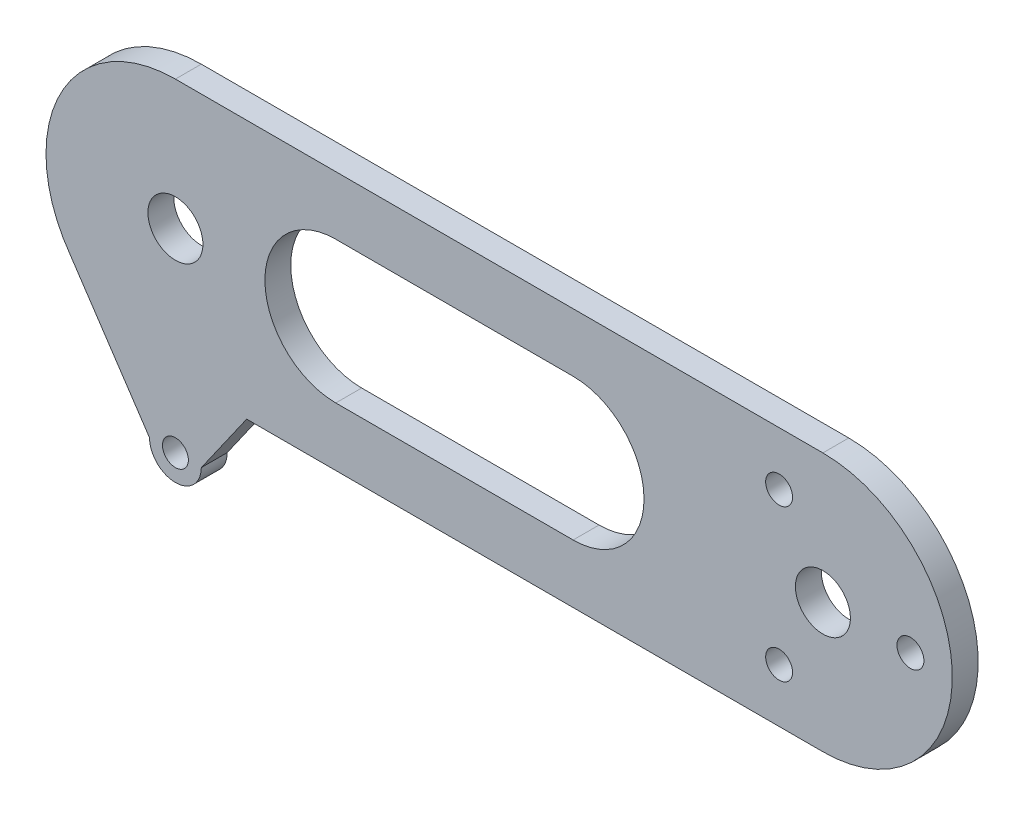
ISO-10303-21;
HEADER;
FILE_DESCRIPTION(('STEP AP214'),'2;1');
FILE_NAME('part.step','',(''),(''),'','','');
FILE_SCHEMA(('AUTOMOTIVE_DESIGN { 1 0 10303 214 1 1 1 1 }'));
ENDSEC;
DATA;
#1=APPLICATION_CONTEXT('core data for automotive mechanical design processes');
#2=APPLICATION_PROTOCOL_DEFINITION('international standard','automotive_design',2000,#1);
#3=PRODUCT_CONTEXT('',#1,'mechanical');
#4=PRODUCT('Part','Part','',(#3));
#5=PRODUCT_RELATED_PRODUCT_CATEGORY('part','',(#4));
#6=PRODUCT_DEFINITION_FORMATION('','',#4);
#7=PRODUCT_DEFINITION_CONTEXT('part definition',#1,'design');
#8=PRODUCT_DEFINITION('design','',#6,#7);
#9=PRODUCT_DEFINITION_SHAPE('','',#8);
#10=(LENGTH_UNIT() NAMED_UNIT(*) SI_UNIT(.MILLI.,.METRE.));
#11=(NAMED_UNIT(*) PLANE_ANGLE_UNIT() SI_UNIT($,.RADIAN.));
#12=(NAMED_UNIT(*) SI_UNIT($,.STERADIAN.) SOLID_ANGLE_UNIT());
#13=UNCERTAINTY_MEASURE_WITH_UNIT(LENGTH_MEASURE(1.E-05),#10,'distance_accuracy_value','');
#14=(GEOMETRIC_REPRESENTATION_CONTEXT(3) GLOBAL_UNCERTAINTY_ASSIGNED_CONTEXT((#13)) GLOBAL_UNIT_ASSIGNED_CONTEXT((#10,
#11,#12)) REPRESENTATION_CONTEXT('',''));
#15=CARTESIAN_POINT('',(0.,0.,0.));
#16=DIRECTION('',(0.,0.,1.));
#17=DIRECTION('',(1.,0.,0.));
#18=AXIS2_PLACEMENT_3D('',#15,#16,#17);
#19=CARTESIAN_POINT('',(-1.00000000000001,0.,4.));
#20=DIRECTION('',(0.,0.,-1.));
#21=DIRECTION('',(-1.,0.,0.));
#22=AXIS2_PLACEMENT_3D('',#19,#20,#21);
#23=PLANE('',#22);
#24=CARTESIAN_POINT('',(92.2992950056397,-11.7173237132034,4.));
#25=DIRECTION('',(0.,0.,1.));
#26=DIRECTION('',(1.,0.,0.));
#27=AXIS2_PLACEMENT_3D('',#24,#25,#26);
#28=CIRCLE('',#27,2.08);
#29=CARTESIAN_POINT('',(94.3792950056397,-11.7173237132034,4.));
#30=VERTEX_POINT('',#29);
#31=EDGE_CURVE('E155',#30,#30,#28,.T.);
#32=ORIENTED_EDGE('',*,*,#31,.F.);
#33=EDGE_LOOP('',(#32));
#34=FACE_BOUND('',#33,.T.);
#35=CARTESIAN_POINT('',(-0.999999999999992,-30.,4.));
#36=DIRECTION('',(0.,0.,1.));
#37=DIRECTION('',(1.,0.,0.));
#38=AXIS2_PLACEMENT_3D('',#35,#36,#37);
#39=CIRCLE('',#38,2.);
#40=CARTESIAN_POINT('',(1.00000000000001,-30.,4.));
#41=VERTEX_POINT('',#40);
#42=EDGE_CURVE('E161',#41,#41,#39,.T.);
#43=ORIENTED_EDGE('',*,*,#42,.F.);
#44=EDGE_LOOP('',(#43));
#45=FACE_BOUND('',#44,.T.);
#46=CARTESIAN_POINT('',(112.59429500564,0.,4.));
#47=DIRECTION('',(0.,0.,1.));
#48=DIRECTION('',(1.,0.,0.));
#49=AXIS2_PLACEMENT_3D('',#46,#47,#48);
#50=CIRCLE('',#49,2.08);
#51=CARTESIAN_POINT('',(114.67429500564,0.,4.));
#52=VERTEX_POINT('',#51);
#53=EDGE_CURVE('E167',#52,#52,#50,.T.);
#54=ORIENTED_EDGE('',*,*,#53,.F.);
#55=EDGE_LOOP('',(#54));
#56=FACE_BOUND('',#55,.T.);
#57=CARTESIAN_POINT('',(-0.999999999999996,0.,4.));
#58=DIRECTION('',(0.,0.,1.));
#59=DIRECTION('',(1.,0.,0.));
#60=AXIS2_PLACEMENT_3D('',#57,#58,#59);
#61=CIRCLE('',#60,4.25);
#62=CARTESIAN_POINT('',(3.25,0.,4.));
#63=VERTEX_POINT('',#62);
#64=EDGE_CURVE('E173',#63,#63,#61,.T.);
#65=ORIENTED_EDGE('',*,*,#64,.F.);
#66=EDGE_LOOP('',(#65));
#67=FACE_BOUND('',#66,.T.);
#68=CARTESIAN_POINT('',(-1.00000000000001,0.,4.));
#69=DIRECTION('',(0.,0.,1.));
#70=DIRECTION('',(-1.,0.,0.));
#71=AXIS2_PLACEMENT_3D('',#68,#69,#70);
#72=CIRCLE('',#71,20.);
#73=CARTESIAN_POINT('',(-1.,20.,4.));
#74=VERTEX_POINT('',#73);
#75=CARTESIAN_POINT('',(-17.2081561258522,-11.7173237132034,4.));
#76=VERTEX_POINT('',#75);
#77=EDGE_CURVE('E179',#74,#76,#72,.T.);
#78=ORIENTED_EDGE('',*,*,#77,.T.);
#79=DIRECTION('',(0.555320589704318,-0.83163636443487,0.));
#80=VECTOR('',#79,1.);
#81=CARTESIAN_POINT('',(-4.99999999999999,-30.,4.));
#82=LINE('',#81,#80);
#83=CARTESIAN_POINT('',(-4.99999999999999,-30.,4.));
#84=VERTEX_POINT('',#83);
#85=EDGE_CURVE('E182',#76,#84,#82,.T.);
#86=ORIENTED_EDGE('',*,*,#85,.T.);
#87=CARTESIAN_POINT('',(-0.999999999999992,-30.,4.));
#88=DIRECTION('',(0.,0.,1.));
#89=DIRECTION('',(1.,0.,0.));
#90=AXIS2_PLACEMENT_3D('',#87,#88,#89);
#91=CIRCLE('',#90,4.);
#92=CARTESIAN_POINT('',(3.00000000000001,-30.,4.));
#93=VERTEX_POINT('',#92);
#94=EDGE_CURVE('E185',#84,#93,#91,.T.);
#95=ORIENTED_EDGE('',*,*,#94,.T.);
#96=DIRECTION('',(0.574260620658506,0.818672547213419,0.));
#97=VECTOR('',#96,1.);
#98=CARTESIAN_POINT('',(3.00000000000001,-30.,4.));
#99=LINE('',#98,#97);
#100=CARTESIAN_POINT('',(10.0145337426198,-20.,4.));
#101=VERTEX_POINT('',#100);
#102=EDGE_CURVE('E187',#93,#101,#99,.T.);
#103=ORIENTED_EDGE('',*,*,#102,.T.);
#104=DIRECTION('',(1.,0.,0.));
#105=VECTOR('',#104,1.);
#106=CARTESIAN_POINT('',(10.0145337426198,-20.,4.));
#107=LINE('',#106,#105);
#108=CARTESIAN_POINT('',(99.0642950056397,-20.,4.));
#109=VERTEX_POINT('',#108);
#110=EDGE_CURVE('E189',#101,#109,#107,.T.);
#111=ORIENTED_EDGE('',*,*,#110,.T.);
#112=CARTESIAN_POINT('',(99.0642950056397,0.,4.));
#113=DIRECTION('',(0.,0.,1.));
#114=DIRECTION('',(-1.,0.,0.));
#115=AXIS2_PLACEMENT_3D('',#112,#113,#114);
#116=CIRCLE('',#115,20.);
#117=CARTESIAN_POINT('',(99.0642950056397,20.,4.));
#118=VERTEX_POINT('',#117);
#119=EDGE_CURVE('E191',#109,#118,#116,.T.);
#120=ORIENTED_EDGE('',*,*,#119,.T.);
#121=DIRECTION('',(-1.,0.,0.));
#122=VECTOR('',#121,1.);
#123=CARTESIAN_POINT('',(-1.,20.,4.));
#124=LINE('',#123,#122);
#125=EDGE_CURVE('E193',#118,#74,#124,.T.);
#126=ORIENTED_EDGE('',*,*,#125,.T.);
#127=EDGE_LOOP('',(#78,#86,#95,#103,#111,#120,#126));
#128=FACE_BOUND('',#127,.T.);
#129=CARTESIAN_POINT('',(23.7835213403292,0.,4.));
#130=DIRECTION('',(0.,0.,1.));
#131=DIRECTION('',(1.,0.,0.));
#132=AXIS2_PLACEMENT_3D('',#129,#130,#131);
#133=CIRCLE('',#132,10.953852889672);
#134=CARTESIAN_POINT('',(23.7835213403292,10.953852889672,4.));
#135=VERTEX_POINT('',#134);
#136=CARTESIAN_POINT('',(23.7835213403292,-10.953852889672,4.));
#137=VERTEX_POINT('',#136);
#138=EDGE_CURVE('E116',#135,#137,#133,.T.);
#139=ORIENTED_EDGE('',*,*,#138,.F.);
#140=DIRECTION('',(-1.,0.,0.));
#141=VECTOR('',#140,1.);
#142=CARTESIAN_POINT('',(23.7835213403292,10.953852889672,4.));
#143=LINE('',#142,#141);
#144=CARTESIAN_POINT('',(60.4664786596708,10.953852889672,4.));
#145=VERTEX_POINT('',#144);
#146=EDGE_CURVE('E139',#145,#135,#143,.T.);
#147=ORIENTED_EDGE('',*,*,#146,.F.);
#148=CARTESIAN_POINT('',(60.4664786596708,0.,4.));
#149=DIRECTION('',(0.,0.,1.));
#150=DIRECTION('',(1.,0.,0.));
#151=AXIS2_PLACEMENT_3D('',#148,#149,#150);
#152=CIRCLE('',#151,10.953852889672);
#153=CARTESIAN_POINT('',(60.4664786596708,-10.953852889672,4.));
#154=VERTEX_POINT('',#153);
#155=EDGE_CURVE('E137',#154,#145,#152,.T.);
#156=ORIENTED_EDGE('',*,*,#155,.F.);
#157=DIRECTION('',(1.,0.,0.));
#158=VECTOR('',#157,1.);
#159=CARTESIAN_POINT('',(23.7835213403292,-10.953852889672,4.));
#160=LINE('',#159,#158);
#161=EDGE_CURVE('E124',#137,#154,#160,.T.);
#162=ORIENTED_EDGE('',*,*,#161,.F.);
#163=EDGE_LOOP('',(#139,#147,#156,#162));
#164=FACE_BOUND('',#163,.T.);
#165=CARTESIAN_POINT('',(92.2992950056398,11.7173237132035,4.));
#166=DIRECTION('',(0.,0.,1.));
#167=DIRECTION('',(1.,0.,0.));
#168=AXIS2_PLACEMENT_3D('',#165,#166,#167);
#169=CIRCLE('',#168,2.08);
#170=CARTESIAN_POINT('',(94.3792950056398,11.7173237132035,4.));
#171=VERTEX_POINT('',#170);
#172=EDGE_CURVE('E145',#171,#171,#169,.T.);
#173=ORIENTED_EDGE('',*,*,#172,.F.);
#174=EDGE_LOOP('',(#173));
#175=FACE_BOUND('',#174,.T.);
#176=CARTESIAN_POINT('',(99.0642950056397,0.,4.));
#177=DIRECTION('',(0.,0.,1.));
#178=DIRECTION('',(1.,0.,0.));
#179=AXIS2_PLACEMENT_3D('',#176,#177,#178);
#180=CIRCLE('',#179,4.25000000000001);
#181=CARTESIAN_POINT('',(103.31429500564,0.,4.));
#182=VERTEX_POINT('',#181);
#183=EDGE_CURVE('E317',#182,#182,#180,.T.);
#184=ORIENTED_EDGE('',*,*,#183,.F.);
#185=EDGE_LOOP('',(#184));
#186=FACE_BOUND('',#185,.T.);
#187=ADVANCED_FACE('F33',(#34,#45,#56,#67,#128,#164,#175,#186),#23,.F.);
#188=CARTESIAN_POINT('',(-1.00000000000001,0.,0.));
#189=DIRECTION('',(0.,0.,-1.));
#190=DIRECTION('',(-1.,0.,0.));
#191=AXIS2_PLACEMENT_3D('',#188,#189,#190);
#192=PLANE('',#191);
#193=CARTESIAN_POINT('',(92.2992950056398,11.7173237132035,0.));
#194=DIRECTION('',(0.,0.,1.));
#195=DIRECTION('',(1.,0.,0.));
#196=AXIS2_PLACEMENT_3D('',#193,#194,#195);
#197=CIRCLE('',#196,2.08);
#198=CARTESIAN_POINT('',(94.3792950056398,11.7173237132035,0.));
#199=VERTEX_POINT('',#198);
#200=EDGE_CURVE('E323',#199,#199,#197,.T.);
#201=ORIENTED_EDGE('',*,*,#200,.T.);
#202=EDGE_LOOP('',(#201));
#203=FACE_BOUND('',#202,.T.);
#204=CARTESIAN_POINT('',(-0.999999999999992,-30.,0.));
#205=DIRECTION('',(0.,0.,1.));
#206=DIRECTION('',(1.,0.,0.));
#207=AXIS2_PLACEMENT_3D('',#204,#205,#206);
#208=CIRCLE('',#207,2.);
#209=CARTESIAN_POINT('',(1.00000000000001,-30.,0.));
#210=VERTEX_POINT('',#209);
#211=EDGE_CURVE('E158',#210,#210,#208,.T.);
#212=ORIENTED_EDGE('',*,*,#211,.T.);
#213=EDGE_LOOP('',(#212));
#214=FACE_BOUND('',#213,.T.);
#215=CARTESIAN_POINT('',(-0.999999999999996,0.,0.));
#216=DIRECTION('',(0.,0.,1.));
#217=DIRECTION('',(1.,0.,0.));
#218=AXIS2_PLACEMENT_3D('',#215,#216,#217);
#219=CIRCLE('',#218,4.25);
#220=CARTESIAN_POINT('',(3.25,0.,0.));
#221=VERTEX_POINT('',#220);
#222=EDGE_CURVE('E170',#221,#221,#219,.T.);
#223=ORIENTED_EDGE('',*,*,#222,.T.);
#224=EDGE_LOOP('',(#223));
#225=FACE_BOUND('',#224,.T.);
#226=CARTESIAN_POINT('',(-1.00000000000001,0.,0.));
#227=DIRECTION('',(0.,0.,1.));
#228=DIRECTION('',(-1.,0.,0.));
#229=AXIS2_PLACEMENT_3D('',#226,#227,#228);
#230=CIRCLE('',#229,20.);
#231=CARTESIAN_POINT('',(-1.,20.,0.));
#232=VERTEX_POINT('',#231);
#233=CARTESIAN_POINT('',(-17.2081561258522,-11.7173237132034,0.));
#234=VERTEX_POINT('',#233);
#235=EDGE_CURVE('E176',#232,#234,#230,.T.);
#236=ORIENTED_EDGE('',*,*,#235,.F.);
#237=DIRECTION('',(-1.,0.,0.));
#238=VECTOR('',#237,1.);
#239=CARTESIAN_POINT('',(-1.,20.,0.));
#240=LINE('',#239,#238);
#241=CARTESIAN_POINT('',(99.0642950056397,20.,0.));
#242=VERTEX_POINT('',#241);
#243=EDGE_CURVE('E183',#242,#232,#240,.T.);
#244=ORIENTED_EDGE('',*,*,#243,.F.);
#245=CARTESIAN_POINT('',(99.0642950056397,0.,0.));
#246=DIRECTION('',(0.,0.,1.));
#247=DIRECTION('',(-1.,0.,0.));
#248=AXIS2_PLACEMENT_3D('',#245,#246,#247);
#249=CIRCLE('',#248,20.);
#250=CARTESIAN_POINT('',(99.0642950056397,-20.,0.));
#251=VERTEX_POINT('',#250);
#252=EDGE_CURVE('E206',#251,#242,#249,.T.);
#253=ORIENTED_EDGE('',*,*,#252,.F.);
#254=DIRECTION('',(1.,0.,0.));
#255=VECTOR('',#254,1.);
#256=CARTESIAN_POINT('',(10.0145337426198,-20.,0.));
#257=LINE('',#256,#255);
#258=CARTESIAN_POINT('',(10.0145337426198,-20.,0.));
#259=VERTEX_POINT('',#258);
#260=EDGE_CURVE('E204',#259,#251,#257,.T.);
#261=ORIENTED_EDGE('',*,*,#260,.F.);
#262=DIRECTION('',(0.574260620658506,0.818672547213419,0.));
#263=VECTOR('',#262,1.);
#264=CARTESIAN_POINT('',(3.00000000000001,-30.,0.));
#265=LINE('',#264,#263);
#266=CARTESIAN_POINT('',(3.00000000000001,-30.,0.));
#267=VERTEX_POINT('',#266);
#268=EDGE_CURVE('E202',#267,#259,#265,.T.);
#269=ORIENTED_EDGE('',*,*,#268,.F.);
#270=CARTESIAN_POINT('',(-0.999999999999992,-30.,0.));
#271=DIRECTION('',(0.,0.,1.));
#272=DIRECTION('',(1.,0.,0.));
#273=AXIS2_PLACEMENT_3D('',#270,#271,#272);
#274=CIRCLE('',#273,4.);
#275=CARTESIAN_POINT('',(-4.99999999999999,-30.,0.));
#276=VERTEX_POINT('',#275);
#277=EDGE_CURVE('E200',#276,#267,#274,.T.);
#278=ORIENTED_EDGE('',*,*,#277,.F.);
#279=DIRECTION('',(0.555320589704318,-0.83163636443487,0.));
#280=VECTOR('',#279,1.);
#281=CARTESIAN_POINT('',(-4.99999999999999,-30.,0.));
#282=LINE('',#281,#280);
#283=EDGE_CURVE('E198',#234,#276,#282,.T.);
#284=ORIENTED_EDGE('',*,*,#283,.F.);
#285=EDGE_LOOP('',(#236,#244,#253,#261,#269,#278,#284));
#286=FACE_BOUND('',#285,.T.);
#287=CARTESIAN_POINT('',(112.59429500564,0.,0.));
#288=DIRECTION('',(0.,0.,1.));
#289=DIRECTION('',(1.,0.,0.));
#290=AXIS2_PLACEMENT_3D('',#287,#288,#289);
#291=CIRCLE('',#290,2.08);
#292=CARTESIAN_POINT('',(114.67429500564,0.,0.));
#293=VERTEX_POINT('',#292);
#294=EDGE_CURVE('E164',#293,#293,#291,.T.);
#295=ORIENTED_EDGE('',*,*,#294,.T.);
#296=EDGE_LOOP('',(#295));
#297=FACE_BOUND('',#296,.T.);
#298=CARTESIAN_POINT('',(92.2992950056397,-11.7173237132034,0.));
#299=DIRECTION('',(0.,0.,1.));
#300=DIRECTION('',(1.,0.,0.));
#301=AXIS2_PLACEMENT_3D('',#298,#299,#300);
#302=CIRCLE('',#301,2.08);
#303=CARTESIAN_POINT('',(94.3792950056397,-11.7173237132034,0.));
#304=VERTEX_POINT('',#303);
#305=EDGE_CURVE('E132',#304,#304,#302,.T.);
#306=ORIENTED_EDGE('',*,*,#305,.T.);
#307=EDGE_LOOP('',(#306));
#308=FACE_BOUND('',#307,.T.);
#309=DIRECTION('',(-1.,0.,0.));
#310=VECTOR('',#309,1.);
#311=CARTESIAN_POINT('',(23.7835213403292,10.953852889672,0.));
#312=LINE('',#311,#310);
#313=CARTESIAN_POINT('',(60.4664786596708,10.953852889672,0.));
#314=VERTEX_POINT('',#313);
#315=CARTESIAN_POINT('',(23.7835213403292,10.953852889672,0.));
#316=VERTEX_POINT('',#315);
#317=EDGE_CURVE('E125',#314,#316,#312,.T.);
#318=ORIENTED_EDGE('',*,*,#317,.T.);
#319=CARTESIAN_POINT('',(23.7835213403292,0.,0.));
#320=DIRECTION('',(0.,0.,1.));
#321=DIRECTION('',(1.,0.,0.));
#322=AXIS2_PLACEMENT_3D('',#319,#320,#321);
#323=CIRCLE('',#322,10.953852889672);
#324=CARTESIAN_POINT('',(23.7835213403292,-10.953852889672,0.));
#325=VERTEX_POINT('',#324);
#326=EDGE_CURVE('E56',#316,#325,#323,.T.);
#327=ORIENTED_EDGE('',*,*,#326,.T.);
#328=DIRECTION('',(1.,0.,0.));
#329=VECTOR('',#328,1.);
#330=CARTESIAN_POINT('',(23.7835213403292,-10.953852889672,0.));
#331=LINE('',#330,#329);
#332=CARTESIAN_POINT('',(60.4664786596708,-10.953852889672,0.));
#333=VERTEX_POINT('',#332);
#334=EDGE_CURVE('E131',#325,#333,#331,.T.);
#335=ORIENTED_EDGE('',*,*,#334,.T.);
#336=CARTESIAN_POINT('',(60.4664786596708,0.,0.));
#337=DIRECTION('',(0.,0.,1.));
#338=DIRECTION('',(1.,0.,0.));
#339=AXIS2_PLACEMENT_3D('',#336,#337,#338);
#340=CIRCLE('',#339,10.953852889672);
#341=EDGE_CURVE('E147',#333,#314,#340,.T.);
#342=ORIENTED_EDGE('',*,*,#341,.T.);
#343=EDGE_LOOP('',(#318,#327,#335,#342));
#344=FACE_BOUND('',#343,.T.);
#345=CARTESIAN_POINT('',(99.0642950056397,0.,0.));
#346=DIRECTION('',(0.,0.,1.));
#347=DIRECTION('',(1.,0.,0.));
#348=AXIS2_PLACEMENT_3D('',#345,#346,#347);
#349=CIRCLE('',#348,4.25000000000001);
#350=CARTESIAN_POINT('',(103.31429500564,0.,0.));
#351=VERTEX_POINT('',#350);
#352=EDGE_CURVE('E320',#351,#351,#349,.T.);
#353=ORIENTED_EDGE('',*,*,#352,.T.);
#354=EDGE_LOOP('',(#353));
#355=FACE_BOUND('',#354,.T.);
#356=ADVANCED_FACE('F233',(#203,#214,#225,#286,#297,#308,#344,#355),#192,.T.);
#357=CARTESIAN_POINT('',(-1.00000000000001,0.,4.));
#358=DIRECTION('',(0.,0.,-1.));
#359=DIRECTION('',(-1.,0.,0.));
#360=AXIS2_PLACEMENT_3D('',#357,#358,#359);
#361=CYLINDRICAL_SURFACE('',#360,20.);
#362=ORIENTED_EDGE('',*,*,#235,.T.);
#363=DIRECTION('',(0.,0.,-1.));
#364=VECTOR('',#363,1.);
#365=CARTESIAN_POINT('',(-17.2081561258522,-11.7173237132034,4.));
#366=LINE('',#365,#364);
#367=EDGE_CURVE('E11',#76,#234,#366,.T.);
#368=ORIENTED_EDGE('',*,*,#367,.F.);
#369=ORIENTED_EDGE('',*,*,#77,.F.);
#370=DIRECTION('',(0.,0.,-1.));
#371=VECTOR('',#370,1.);
#372=CARTESIAN_POINT('',(-1.,20.,4.));
#373=LINE('',#372,#371);
#374=EDGE_CURVE('E195',#74,#232,#373,.T.);
#375=ORIENTED_EDGE('',*,*,#374,.T.);
#376=EDGE_LOOP('',(#362,#368,#369,#375));
#377=FACE_BOUND('',#376,.T.);
#378=ADVANCED_FACE('F35',(#377),#361,.T.);
#379=CARTESIAN_POINT('',(-4.99999999999999,-30.,4.));
#380=DIRECTION('',(0.83163636443487,0.555320589704318,0.));
#381=DIRECTION('',(-0.555320589704318,0.83163636443487,0.));
#382=AXIS2_PLACEMENT_3D('',#379,#380,#381);
#383=PLANE('',#382);
#384=ORIENTED_EDGE('',*,*,#283,.T.);
#385=DIRECTION('',(0.,0.,-1.));
#386=VECTOR('',#385,1.);
#387=CARTESIAN_POINT('',(-4.99999999999999,-30.,4.));
#388=LINE('',#387,#386);
#389=EDGE_CURVE('E41',#84,#276,#388,.T.);
#390=ORIENTED_EDGE('',*,*,#389,.F.);
#391=ORIENTED_EDGE('',*,*,#85,.F.);
#392=ORIENTED_EDGE('',*,*,#367,.T.);
#393=EDGE_LOOP('',(#384,#390,#391,#392));
#394=FACE_BOUND('',#393,.T.);
#395=ADVANCED_FACE('F250',(#394),#383,.F.);
#396=CARTESIAN_POINT('',(-0.999999999999992,-30.,4.));
#397=DIRECTION('',(0.,0.,-1.));
#398=DIRECTION('',(-1.,0.,0.));
#399=AXIS2_PLACEMENT_3D('',#396,#397,#398);
#400=CYLINDRICAL_SURFACE('',#399,4.);
#401=ORIENTED_EDGE('',*,*,#277,.T.);
#402=DIRECTION('',(0.,0.,-1.));
#403=VECTOR('',#402,1.);
#404=CARTESIAN_POINT('',(3.00000000000001,-30.,4.));
#405=LINE('',#404,#403);
#406=EDGE_CURVE('E220',#93,#267,#405,.T.);
#407=ORIENTED_EDGE('',*,*,#406,.F.);
#408=ORIENTED_EDGE('',*,*,#94,.F.);
#409=ORIENTED_EDGE('',*,*,#389,.T.);
#410=EDGE_LOOP('',(#401,#407,#408,#409));
#411=FACE_BOUND('',#410,.T.);
#412=ADVANCED_FACE('F227',(#411),#400,.T.);
#413=CARTESIAN_POINT('',(3.00000000000001,-30.,4.));
#414=DIRECTION('',(-0.818672547213419,0.574260620658506,0.));
#415=DIRECTION('',(-0.574260620658506,-0.818672547213419,0.));
#416=AXIS2_PLACEMENT_3D('',#413,#414,#415);
#417=PLANE('',#416);
#418=ORIENTED_EDGE('',*,*,#268,.T.);
#419=DIRECTION('',(0.,0.,-1.));
#420=VECTOR('',#419,1.);
#421=CARTESIAN_POINT('',(10.0145337426198,-20.,4.));
#422=LINE('',#421,#420);
#423=EDGE_CURVE('E217',#101,#259,#422,.T.);
#424=ORIENTED_EDGE('',*,*,#423,.F.);
#425=ORIENTED_EDGE('',*,*,#102,.F.);
#426=ORIENTED_EDGE('',*,*,#406,.T.);
#427=EDGE_LOOP('',(#418,#424,#425,#426));
#428=FACE_BOUND('',#427,.T.);
#429=ADVANCED_FACE('F239',(#428),#417,.F.);
#430=CARTESIAN_POINT('',(10.0145337426198,-20.,4.));
#431=DIRECTION('',(0.,1.,0.));
#432=DIRECTION('',(-1.,0.,0.));
#433=AXIS2_PLACEMENT_3D('',#430,#431,#432);
#434=PLANE('',#433);
#435=ORIENTED_EDGE('',*,*,#260,.T.);
#436=DIRECTION('',(0.,0.,-1.));
#437=VECTOR('',#436,1.);
#438=CARTESIAN_POINT('',(99.0642950056397,-20.,4.));
#439=LINE('',#438,#437);
#440=EDGE_CURVE('E214',#109,#251,#439,.T.);
#441=ORIENTED_EDGE('',*,*,#440,.F.);
#442=ORIENTED_EDGE('',*,*,#110,.F.);
#443=ORIENTED_EDGE('',*,*,#423,.T.);
#444=EDGE_LOOP('',(#435,#441,#442,#443));
#445=FACE_BOUND('',#444,.T.);
#446=ADVANCED_FACE('F243',(#445),#434,.F.);
#447=CARTESIAN_POINT('',(99.0642950056397,0.,4.));
#448=DIRECTION('',(0.,0.,-1.));
#449=DIRECTION('',(-1.,0.,0.));
#450=AXIS2_PLACEMENT_3D('',#447,#448,#449);
#451=CYLINDRICAL_SURFACE('',#450,20.);
#452=ORIENTED_EDGE('',*,*,#252,.T.);
#453=DIRECTION('',(0.,0.,-1.));
#454=VECTOR('',#453,1.);
#455=CARTESIAN_POINT('',(99.0642950056397,20.,4.));
#456=LINE('',#455,#454);
#457=EDGE_CURVE('E211',#118,#242,#456,.T.);
#458=ORIENTED_EDGE('',*,*,#457,.F.);
#459=ORIENTED_EDGE('',*,*,#119,.F.);
#460=ORIENTED_EDGE('',*,*,#440,.T.);
#461=EDGE_LOOP('',(#452,#458,#459,#460));
#462=FACE_BOUND('',#461,.T.);
#463=ADVANCED_FACE('F258',(#462),#451,.T.);
#464=CARTESIAN_POINT('',(-1.,20.,4.));
#465=DIRECTION('',(0.,-1.,0.));
#466=DIRECTION('',(0.,0.,-1.));
#467=AXIS2_PLACEMENT_3D('',#464,#465,#466);
#468=PLANE('',#467);
#469=ORIENTED_EDGE('',*,*,#243,.T.);
#470=ORIENTED_EDGE('',*,*,#374,.F.);
#471=ORIENTED_EDGE('',*,*,#125,.F.);
#472=ORIENTED_EDGE('',*,*,#457,.T.);
#473=EDGE_LOOP('',(#469,#470,#471,#472));
#474=FACE_BOUND('',#473,.T.);
#475=ADVANCED_FACE('F255',(#474),#468,.F.);
#476=CARTESIAN_POINT('',(-0.999999999999996,0.,4.));
#477=DIRECTION('',(0.,0.,-1.));
#478=DIRECTION('',(-1.,0.,0.));
#479=AXIS2_PLACEMENT_3D('',#476,#477,#478);
#480=CYLINDRICAL_SURFACE('',#479,4.25);
#481=ORIENTED_EDGE('',*,*,#64,.T.);
#482=EDGE_LOOP('',(#481));
#483=FACE_BOUND('',#482,.T.);
#484=ORIENTED_EDGE('',*,*,#222,.F.);
#485=EDGE_LOOP('',(#484));
#486=FACE_BOUND('',#485,.T.);
#487=ADVANCED_FACE('F265',(#483,#486),#480,.F.);
#488=CARTESIAN_POINT('',(112.59429500564,0.,4.));
#489=DIRECTION('',(0.,0.,-1.));
#490=DIRECTION('',(-1.,0.,0.));
#491=AXIS2_PLACEMENT_3D('',#488,#489,#490);
#492=CYLINDRICAL_SURFACE('',#491,2.08);
#493=ORIENTED_EDGE('',*,*,#53,.T.);
#494=EDGE_LOOP('',(#493));
#495=FACE_BOUND('',#494,.T.);
#496=ORIENTED_EDGE('',*,*,#294,.F.);
#497=EDGE_LOOP('',(#496));
#498=FACE_BOUND('',#497,.T.);
#499=ADVANCED_FACE('F281',(#495,#498),#492,.F.);
#500=CARTESIAN_POINT('',(-0.999999999999992,-30.,4.));
#501=DIRECTION('',(0.,0.,-1.));
#502=DIRECTION('',(-1.,0.,0.));
#503=AXIS2_PLACEMENT_3D('',#500,#501,#502);
#504=CYLINDRICAL_SURFACE('',#503,2.);
#505=ORIENTED_EDGE('',*,*,#42,.T.);
#506=EDGE_LOOP('',(#505));
#507=FACE_BOUND('',#506,.T.);
#508=ORIENTED_EDGE('',*,*,#211,.F.);
#509=EDGE_LOOP('',(#508));
#510=FACE_BOUND('',#509,.T.);
#511=ADVANCED_FACE('F285',(#507,#510),#504,.F.);
#512=CARTESIAN_POINT('',(92.2992950056397,-11.7173237132034,4.));
#513=DIRECTION('',(0.,0.,-1.));
#514=DIRECTION('',(-1.,0.,0.));
#515=AXIS2_PLACEMENT_3D('',#512,#513,#514);
#516=CYLINDRICAL_SURFACE('',#515,2.08);
#517=ORIENTED_EDGE('',*,*,#31,.T.);
#518=EDGE_LOOP('',(#517));
#519=FACE_BOUND('',#518,.T.);
#520=ORIENTED_EDGE('',*,*,#305,.F.);
#521=EDGE_LOOP('',(#520));
#522=FACE_BOUND('',#521,.T.);
#523=ADVANCED_FACE('F289',(#519,#522),#516,.F.);
#524=CARTESIAN_POINT('',(23.7835213403292,0.,4.));
#525=DIRECTION('',(0.,0.,-1.));
#526=DIRECTION('',(-1.,0.,0.));
#527=AXIS2_PLACEMENT_3D('',#524,#525,#526);
#528=CYLINDRICAL_SURFACE('',#527,10.953852889672);
#529=ORIENTED_EDGE('',*,*,#326,.F.);
#530=DIRECTION('',(0.,0.,-1.));
#531=VECTOR('',#530,1.);
#532=CARTESIAN_POINT('',(23.7835213403292,10.953852889672,4.));
#533=LINE('',#532,#531);
#534=EDGE_CURVE('E120',#135,#316,#533,.T.);
#535=ORIENTED_EDGE('',*,*,#534,.F.);
#536=ORIENTED_EDGE('',*,*,#138,.T.);
#537=DIRECTION('',(0.,0.,-1.));
#538=VECTOR('',#537,1.);
#539=CARTESIAN_POINT('',(23.7835213403292,-10.953852889672,4.));
#540=LINE('',#539,#538);
#541=EDGE_CURVE('E119',#137,#325,#540,.T.);
#542=ORIENTED_EDGE('',*,*,#541,.T.);
#543=EDGE_LOOP('',(#529,#535,#536,#542));
#544=FACE_BOUND('',#543,.T.);
#545=ADVANCED_FACE('F118',(#544),#528,.F.);
#546=CARTESIAN_POINT('',(23.7835213403292,-10.953852889672,4.));
#547=DIRECTION('',(0.,1.,0.));
#548=DIRECTION('',(-1.,0.,0.));
#549=AXIS2_PLACEMENT_3D('',#546,#547,#548);
#550=PLANE('',#549);
#551=ORIENTED_EDGE('',*,*,#334,.F.);
#552=ORIENTED_EDGE('',*,*,#541,.F.);
#553=ORIENTED_EDGE('',*,*,#161,.T.);
#554=DIRECTION('',(0.,0.,-1.));
#555=VECTOR('',#554,1.);
#556=CARTESIAN_POINT('',(60.4664786596708,-10.953852889672,4.));
#557=LINE('',#556,#555);
#558=EDGE_CURVE('E133',#154,#333,#557,.T.);
#559=ORIENTED_EDGE('',*,*,#558,.T.);
#560=EDGE_LOOP('',(#551,#552,#553,#559));
#561=FACE_BOUND('',#560,.T.);
#562=ADVANCED_FACE('F128',(#561),#550,.T.);
#563=CARTESIAN_POINT('',(60.4664786596708,0.,4.));
#564=DIRECTION('',(0.,0.,-1.));
#565=DIRECTION('',(-1.,0.,0.));
#566=AXIS2_PLACEMENT_3D('',#563,#564,#565);
#567=CYLINDRICAL_SURFACE('',#566,10.953852889672);
#568=ORIENTED_EDGE('',*,*,#341,.F.);
#569=ORIENTED_EDGE('',*,*,#558,.F.);
#570=ORIENTED_EDGE('',*,*,#155,.T.);
#571=DIRECTION('',(0.,0.,-1.));
#572=VECTOR('',#571,1.);
#573=CARTESIAN_POINT('',(60.4664786596708,10.953852889672,4.));
#574=LINE('',#573,#572);
#575=EDGE_CURVE('E48',#145,#314,#574,.T.);
#576=ORIENTED_EDGE('',*,*,#575,.T.);
#577=EDGE_LOOP('',(#568,#569,#570,#576));
#578=FACE_BOUND('',#577,.T.);
#579=ADVANCED_FACE('F298',(#578),#567,.F.);
#580=CARTESIAN_POINT('',(23.7835213403292,10.953852889672,4.));
#581=DIRECTION('',(0.,-1.,0.));
#582=DIRECTION('',(1.,0.,0.));
#583=AXIS2_PLACEMENT_3D('',#580,#581,#582);
#584=PLANE('',#583);
#585=ORIENTED_EDGE('',*,*,#317,.F.);
#586=ORIENTED_EDGE('',*,*,#575,.F.);
#587=ORIENTED_EDGE('',*,*,#146,.T.);
#588=ORIENTED_EDGE('',*,*,#534,.T.);
#589=EDGE_LOOP('',(#585,#586,#587,#588));
#590=FACE_BOUND('',#589,.T.);
#591=ADVANCED_FACE('F301',(#590),#584,.T.);
#592=CARTESIAN_POINT('',(92.2992950056398,11.7173237132035,4.));
#593=DIRECTION('',(0.,0.,-1.));
#594=DIRECTION('',(-1.,0.,0.));
#595=AXIS2_PLACEMENT_3D('',#592,#593,#594);
#596=CYLINDRICAL_SURFACE('',#595,2.08);
#597=ORIENTED_EDGE('',*,*,#172,.T.);
#598=EDGE_LOOP('',(#597));
#599=FACE_BOUND('',#598,.T.);
#600=ORIENTED_EDGE('',*,*,#200,.F.);
#601=EDGE_LOOP('',(#600));
#602=FACE_BOUND('',#601,.T.);
#603=ADVANCED_FACE('F305',(#599,#602),#596,.F.);
#604=CARTESIAN_POINT('',(99.0642950056397,0.,4.));
#605=DIRECTION('',(0.,0.,-1.));
#606=DIRECTION('',(-1.,0.,0.));
#607=AXIS2_PLACEMENT_3D('',#604,#605,#606);
#608=CYLINDRICAL_SURFACE('',#607,4.25000000000001);
#609=ORIENTED_EDGE('',*,*,#183,.T.);
#610=EDGE_LOOP('',(#609));
#611=FACE_BOUND('',#610,.T.);
#612=ORIENTED_EDGE('',*,*,#352,.F.);
#613=EDGE_LOOP('',(#612));
#614=FACE_BOUND('',#613,.T.);
#615=ADVANCED_FACE('F308',(#611,#614),#608,.F.);
#616=CLOSED_SHELL('',(#187,#356,#378,#395,#412,#429,#446,#463,#475,#487,#499,#511,#523,#545,
#562,#579,#591,#603,#615));
#617=MANIFOLD_SOLID_BREP('B2',#616);
#618=ADVANCED_BREP_SHAPE_REPRESENTATION('',(#18,#617),#14);
#619=SHAPE_DEFINITION_REPRESENTATION(#9,#618);
ENDSEC;
END-ISO-10303-21;
